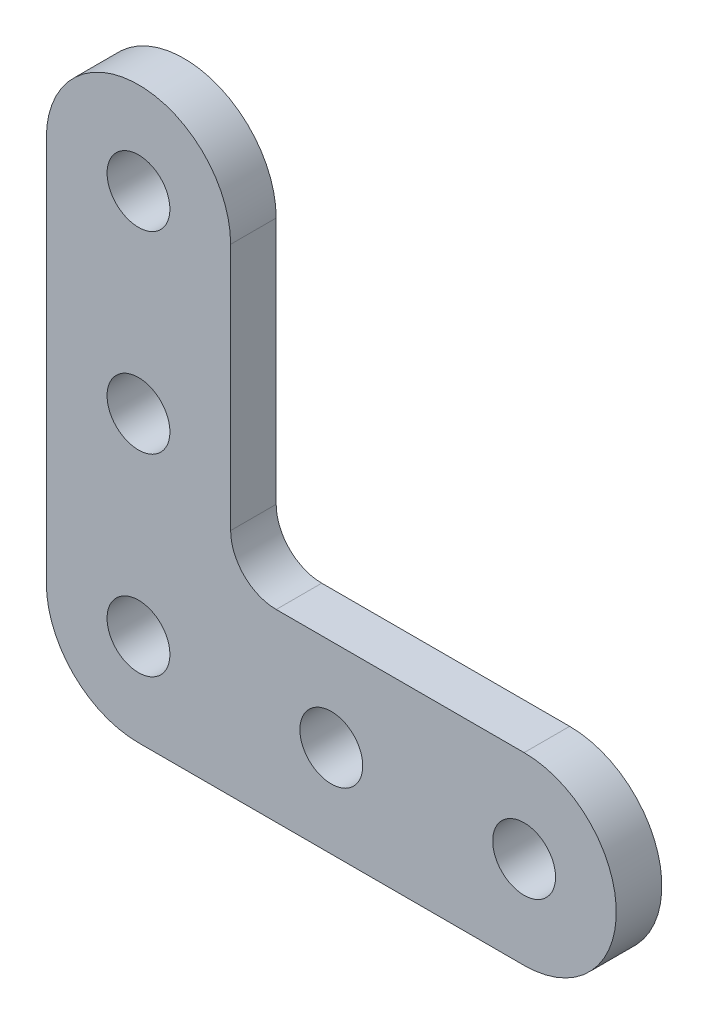
ISO-10303-21;
HEADER;
FILE_DESCRIPTION(('STEP AP214'),'2;1');
FILE_NAME('part.step','',(''),(''),'','','');
FILE_SCHEMA(('AUTOMOTIVE_DESIGN { 1 0 10303 214 1 1 1 1 }'));
ENDSEC;
DATA;
#1=APPLICATION_CONTEXT('core data for automotive mechanical design processes');
#2=APPLICATION_PROTOCOL_DEFINITION('international standard','automotive_design',2000,#1);
#3=PRODUCT_CONTEXT('',#1,'mechanical');
#4=PRODUCT('Part','Part','',(#3));
#5=PRODUCT_RELATED_PRODUCT_CATEGORY('part','',(#4));
#6=PRODUCT_DEFINITION_FORMATION('','',#4);
#7=PRODUCT_DEFINITION_CONTEXT('part definition',#1,'design');
#8=PRODUCT_DEFINITION('design','',#6,#7);
#9=PRODUCT_DEFINITION_SHAPE('','',#8);
#10=(LENGTH_UNIT() NAMED_UNIT(*) SI_UNIT(.MILLI.,.METRE.));
#11=(NAMED_UNIT(*) PLANE_ANGLE_UNIT() SI_UNIT($,.RADIAN.));
#12=(NAMED_UNIT(*) SI_UNIT($,.STERADIAN.) SOLID_ANGLE_UNIT());
#13=UNCERTAINTY_MEASURE_WITH_UNIT(LENGTH_MEASURE(1.E-05),#10,'distance_accuracy_value','');
#14=(GEOMETRIC_REPRESENTATION_CONTEXT(3) GLOBAL_UNCERTAINTY_ASSIGNED_CONTEXT((#13)) GLOBAL_UNIT_ASSIGNED_CONTEXT((#10,
#11,#12)) REPRESENTATION_CONTEXT('',''));
#15=CARTESIAN_POINT('',(0.,0.,0.));
#16=DIRECTION('',(0.,0.,1.));
#17=DIRECTION('',(1.,0.,0.));
#18=AXIS2_PLACEMENT_3D('',#15,#16,#17);
#19=CARTESIAN_POINT('',(-6.07,0.,1.5));
#20=DIRECTION('',(1.,0.,0.));
#21=DIRECTION('',(0.,0.,-1.));
#22=AXIS2_PLACEMENT_3D('',#19,#20,#21);
#23=PLANE('',#22);
#24=DIRECTION('',(0.,-1.,0.));
#25=VECTOR('',#24,1.);
#26=CARTESIAN_POINT('',(-6.07,0.,-1.5));
#27=LINE('',#26,#25);
#28=CARTESIAN_POINT('',(-6.07,25.4,-1.5));
#29=VERTEX_POINT('',#28);
#30=CARTESIAN_POINT('',(-6.07,0.,-1.5));
#31=VERTEX_POINT('',#30);
#32=EDGE_CURVE('E132',#29,#31,#27,.T.);
#33=ORIENTED_EDGE('',*,*,#32,.T.);
#34=DIRECTION('',(0.,0.,-1.));
#35=VECTOR('',#34,1.);
#36=CARTESIAN_POINT('',(-6.07,0.,1.5));
#37=LINE('',#36,#35);
#38=CARTESIAN_POINT('',(-6.07,0.,1.5));
#39=VERTEX_POINT('',#38);
#40=EDGE_CURVE('E109',#39,#31,#37,.T.);
#41=ORIENTED_EDGE('',*,*,#40,.F.);
#42=DIRECTION('',(0.,-1.,0.));
#43=VECTOR('',#42,1.);
#44=CARTESIAN_POINT('',(-6.07,0.,1.5));
#45=LINE('',#44,#43);
#46=CARTESIAN_POINT('',(-6.07,25.4,1.5));
#47=VERTEX_POINT('',#46);
#48=EDGE_CURVE('E117',#47,#39,#45,.T.);
#49=ORIENTED_EDGE('',*,*,#48,.F.);
#50=DIRECTION('',(0.,0.,-1.));
#51=VECTOR('',#50,1.);
#52=CARTESIAN_POINT('',(-6.07,25.4,1.5));
#53=LINE('',#52,#51);
#54=EDGE_CURVE('E156',#47,#29,#53,.T.);
#55=ORIENTED_EDGE('',*,*,#54,.T.);
#56=EDGE_LOOP('',(#33,#41,#49,#55));
#57=FACE_BOUND('',#56,.T.);
#58=ADVANCED_FACE('F39',(#57),#23,.F.);
#59=CARTESIAN_POINT('',(0.,0.,1.5));
#60=DIRECTION('',(0.,0.,-1.));
#61=DIRECTION('',(-1.,0.,0.));
#62=AXIS2_PLACEMENT_3D('',#59,#60,#61);
#63=CYLINDRICAL_SURFACE('',#62,6.07);
#64=CARTESIAN_POINT('',(0.,0.,-1.5));
#65=DIRECTION('',(0.,0.,1.));
#66=DIRECTION('',(1.,0.,0.));
#67=AXIS2_PLACEMENT_3D('',#64,#65,#66);
#68=CIRCLE('',#67,6.07);
#69=CARTESIAN_POINT('',(0.,-6.07,-1.5));
#70=VERTEX_POINT('',#69);
#71=EDGE_CURVE('E194',#31,#70,#68,.T.);
#72=ORIENTED_EDGE('',*,*,#71,.T.);
#73=DIRECTION('',(0.,0.,-1.));
#74=VECTOR('',#73,1.);
#75=CARTESIAN_POINT('',(0.,-6.07,1.5));
#76=LINE('',#75,#74);
#77=CARTESIAN_POINT('',(0.,-6.07,1.5));
#78=VERTEX_POINT('',#77);
#79=EDGE_CURVE('E112',#78,#70,#76,.T.);
#80=ORIENTED_EDGE('',*,*,#79,.F.);
#81=CARTESIAN_POINT('',(0.,0.,1.5));
#82=DIRECTION('',(0.,0.,1.));
#83=DIRECTION('',(1.,0.,0.));
#84=AXIS2_PLACEMENT_3D('',#81,#82,#83);
#85=CIRCLE('',#84,6.07);
#86=EDGE_CURVE('E105',#39,#78,#85,.T.);
#87=ORIENTED_EDGE('',*,*,#86,.F.);
#88=ORIENTED_EDGE('',*,*,#40,.T.);
#89=EDGE_LOOP('',(#72,#80,#87,#88));
#90=FACE_BOUND('',#89,.T.);
#91=ADVANCED_FACE('F107',(#90),#63,.T.);
#92=CARTESIAN_POINT('',(0.,-6.07,1.5));
#93=DIRECTION('',(0.,1.,0.));
#94=DIRECTION('',(-1.,0.,0.));
#95=AXIS2_PLACEMENT_3D('',#92,#93,#94);
#96=PLANE('',#95);
#97=DIRECTION('',(1.,0.,0.));
#98=VECTOR('',#97,1.);
#99=CARTESIAN_POINT('',(0.,-6.07,-1.5));
#100=LINE('',#99,#98);
#101=CARTESIAN_POINT('',(25.4,-6.07,-1.5));
#102=VERTEX_POINT('',#101);
#103=EDGE_CURVE('E191',#70,#102,#100,.T.);
#104=ORIENTED_EDGE('',*,*,#103,.T.);
#105=DIRECTION('',(0.,0.,-1.));
#106=VECTOR('',#105,1.);
#107=CARTESIAN_POINT('',(25.4,-6.07,1.5));
#108=LINE('',#107,#106);
#109=CARTESIAN_POINT('',(25.4,-6.07,1.5));
#110=VERTEX_POINT('',#109);
#111=EDGE_CURVE('E140',#110,#102,#108,.T.);
#112=ORIENTED_EDGE('',*,*,#111,.F.);
#113=DIRECTION('',(1.,0.,0.));
#114=VECTOR('',#113,1.);
#115=CARTESIAN_POINT('',(0.,-6.07,1.5));
#116=LINE('',#115,#114);
#117=EDGE_CURVE('E116',#78,#110,#116,.T.);
#118=ORIENTED_EDGE('',*,*,#117,.F.);
#119=ORIENTED_EDGE('',*,*,#79,.T.);
#120=EDGE_LOOP('',(#104,#112,#118,#119));
#121=FACE_BOUND('',#120,.T.);
#122=ADVANCED_FACE('F235',(#121),#96,.F.);
#123=CARTESIAN_POINT('',(25.4,0.,1.5));
#124=DIRECTION('',(0.,0.,-1.));
#125=DIRECTION('',(-1.,0.,0.));
#126=AXIS2_PLACEMENT_3D('',#123,#124,#125);
#127=CYLINDRICAL_SURFACE('',#126,6.07);
#128=CARTESIAN_POINT('',(25.4,0.,-1.5));
#129=DIRECTION('',(0.,0.,1.));
#130=DIRECTION('',(1.,0.,0.));
#131=AXIS2_PLACEMENT_3D('',#128,#129,#130);
#132=CIRCLE('',#131,6.07);
#133=CARTESIAN_POINT('',(25.4,6.07,-1.5));
#134=VERTEX_POINT('',#133);
#135=EDGE_CURVE('E188',#102,#134,#132,.T.);
#136=ORIENTED_EDGE('',*,*,#135,.T.);
#137=DIRECTION('',(0.,0.,-1.));
#138=VECTOR('',#137,1.);
#139=CARTESIAN_POINT('',(25.4,6.07,1.5));
#140=LINE('',#139,#138);
#141=CARTESIAN_POINT('',(25.4,6.07,1.5));
#142=VERTEX_POINT('',#141);
#143=EDGE_CURVE('E149',#142,#134,#140,.T.);
#144=ORIENTED_EDGE('',*,*,#143,.F.);
#145=CARTESIAN_POINT('',(25.4,0.,1.5));
#146=DIRECTION('',(0.,0.,1.));
#147=DIRECTION('',(1.,0.,0.));
#148=AXIS2_PLACEMENT_3D('',#145,#146,#147);
#149=CIRCLE('',#148,6.07);
#150=EDGE_CURVE('E227',#110,#142,#149,.T.);
#151=ORIENTED_EDGE('',*,*,#150,.F.);
#152=ORIENTED_EDGE('',*,*,#111,.T.);
#153=EDGE_LOOP('',(#136,#144,#151,#152));
#154=FACE_BOUND('',#153,.T.);
#155=ADVANCED_FACE('F239',(#154),#127,.T.);
#156=CARTESIAN_POINT('',(0.,6.07,1.5));
#157=DIRECTION('',(0.,-1.,0.));
#158=DIRECTION('',(1.,0.,0.));
#159=AXIS2_PLACEMENT_3D('',#156,#157,#158);
#160=PLANE('',#159);
#161=DIRECTION('',(-1.,0.,0.));
#162=VECTOR('',#161,1.);
#163=CARTESIAN_POINT('',(0.,6.07,-1.5));
#164=LINE('',#163,#162);
#165=CARTESIAN_POINT('',(9.07,6.07,-1.5));
#166=VERTEX_POINT('',#165);
#167=EDGE_CURVE('E185',#134,#166,#164,.T.);
#168=ORIENTED_EDGE('',*,*,#167,.T.);
#169=DIRECTION('',(0.,0.,-1.));
#170=VECTOR('',#169,1.);
#171=CARTESIAN_POINT('',(9.07,6.07,1.5));
#172=LINE('',#171,#170);
#173=CARTESIAN_POINT('',(9.07,6.07,1.5));
#174=VERTEX_POINT('',#173);
#175=EDGE_CURVE('E55',#166,#174,#172,.F.);
#176=ORIENTED_EDGE('',*,*,#175,.T.);
#177=DIRECTION('',(-1.,0.,0.));
#178=VECTOR('',#177,1.);
#179=CARTESIAN_POINT('',(0.,6.07,1.5));
#180=LINE('',#179,#178);
#181=EDGE_CURVE('E224',#142,#174,#180,.T.);
#182=ORIENTED_EDGE('',*,*,#181,.F.);
#183=ORIENTED_EDGE('',*,*,#143,.T.);
#184=EDGE_LOOP('',(#168,#176,#182,#183));
#185=FACE_BOUND('',#184,.T.);
#186=ADVANCED_FACE('F240',(#185),#160,.F.);
#187=CARTESIAN_POINT('',(6.07,0.,1.5));
#188=DIRECTION('',(1.,0.,0.));
#189=DIRECTION('',(0.,0.,-1.));
#190=AXIS2_PLACEMENT_3D('',#187,#188,#189);
#191=PLANE('',#190);
#192=DIRECTION('',(0.,-1.,0.));
#193=VECTOR('',#192,1.);
#194=CARTESIAN_POINT('',(6.07,0.,1.5));
#195=LINE('',#194,#193);
#196=CARTESIAN_POINT('',(6.07,25.4,1.5));
#197=VERTEX_POINT('',#196);
#198=CARTESIAN_POINT('',(6.07,9.07,1.5));
#199=VERTEX_POINT('',#198);
#200=EDGE_CURVE('E220',#197,#199,#195,.T.);
#201=ORIENTED_EDGE('',*,*,#200,.T.);
#202=DIRECTION('',(0.,0.,-1.));
#203=VECTOR('',#202,1.);
#204=CARTESIAN_POINT('',(6.07,9.07,1.5));
#205=LINE('',#204,#203);
#206=CARTESIAN_POINT('',(6.07,9.07,-1.5));
#207=VERTEX_POINT('',#206);
#208=EDGE_CURVE('E134',#199,#207,#205,.T.);
#209=ORIENTED_EDGE('',*,*,#208,.T.);
#210=DIRECTION('',(0.,-1.,0.));
#211=VECTOR('',#210,1.);
#212=CARTESIAN_POINT('',(6.07,0.,-1.5));
#213=LINE('',#212,#211);
#214=CARTESIAN_POINT('',(6.07,25.4,-1.5));
#215=VERTEX_POINT('',#214);
#216=EDGE_CURVE('E182',#215,#207,#213,.T.);
#217=ORIENTED_EDGE('',*,*,#216,.F.);
#218=DIRECTION('',(0.,0.,-1.));
#219=VECTOR('',#218,1.);
#220=CARTESIAN_POINT('',(6.07,25.4,1.5));
#221=LINE('',#220,#219);
#222=EDGE_CURVE('E153',#197,#215,#221,.T.);
#223=ORIENTED_EDGE('',*,*,#222,.F.);
#224=EDGE_LOOP('',(#201,#209,#217,#223));
#225=FACE_BOUND('',#224,.T.);
#226=ADVANCED_FACE('F246',(#225),#191,.T.);
#227=CARTESIAN_POINT('',(0.,0.,1.5));
#228=DIRECTION('',(0.,0.,-1.));
#229=DIRECTION('',(-1.,0.,0.));
#230=AXIS2_PLACEMENT_3D('',#227,#228,#229);
#231=CYLINDRICAL_SURFACE('',#230,2.07);
#232=CARTESIAN_POINT('',(0.,0.,1.5));
#233=DIRECTION('',(0.,0.,1.));
#234=DIRECTION('',(1.,0.,0.));
#235=AXIS2_PLACEMENT_3D('',#232,#233,#234);
#236=CIRCLE('',#235,2.07);
#237=CARTESIAN_POINT('',(2.07,0.,1.5));
#238=VERTEX_POINT('',#237);
#239=EDGE_CURVE('E202',#238,#238,#236,.T.);
#240=ORIENTED_EDGE('',*,*,#239,.T.);
#241=EDGE_LOOP('',(#240));
#242=FACE_BOUND('',#241,.T.);
#243=CARTESIAN_POINT('',(0.,0.,-1.5));
#244=DIRECTION('',(0.,0.,1.));
#245=DIRECTION('',(1.,0.,0.));
#246=AXIS2_PLACEMENT_3D('',#243,#244,#245);
#247=CIRCLE('',#246,2.07);
#248=CARTESIAN_POINT('',(2.07,0.,-1.5));
#249=VERTEX_POINT('',#248);
#250=EDGE_CURVE('E163',#249,#249,#247,.T.);
#251=ORIENTED_EDGE('',*,*,#250,.F.);
#252=EDGE_LOOP('',(#251));
#253=FACE_BOUND('',#252,.T.);
#254=ADVANCED_FACE('F278',(#242,#253),#231,.F.);
#255=CARTESIAN_POINT('',(12.7,0.,1.5));
#256=DIRECTION('',(0.,0.,-1.));
#257=DIRECTION('',(-1.,0.,0.));
#258=AXIS2_PLACEMENT_3D('',#255,#256,#257);
#259=CYLINDRICAL_SURFACE('',#258,2.07);
#260=CARTESIAN_POINT('',(12.7,0.,1.5));
#261=DIRECTION('',(0.,0.,1.));
#262=DIRECTION('',(1.,0.,0.));
#263=AXIS2_PLACEMENT_3D('',#260,#261,#262);
#264=CIRCLE('',#263,2.07);
#265=CARTESIAN_POINT('',(14.77,0.,1.5));
#266=VERTEX_POINT('',#265);
#267=EDGE_CURVE('E206',#266,#266,#264,.T.);
#268=ORIENTED_EDGE('',*,*,#267,.T.);
#269=EDGE_LOOP('',(#268));
#270=FACE_BOUND('',#269,.T.);
#271=CARTESIAN_POINT('',(12.7,0.,-1.5));
#272=DIRECTION('',(0.,0.,1.));
#273=DIRECTION('',(1.,0.,0.));
#274=AXIS2_PLACEMENT_3D('',#271,#272,#273);
#275=CIRCLE('',#274,2.07);
#276=CARTESIAN_POINT('',(14.77,0.,-1.5));
#277=VERTEX_POINT('',#276);
#278=EDGE_CURVE('E167',#277,#277,#275,.T.);
#279=ORIENTED_EDGE('',*,*,#278,.F.);
#280=EDGE_LOOP('',(#279));
#281=FACE_BOUND('',#280,.T.);
#282=ADVANCED_FACE('F282',(#270,#281),#259,.F.);
#283=CARTESIAN_POINT('',(0.,25.4,1.5));
#284=DIRECTION('',(0.,0.,-1.));
#285=DIRECTION('',(-1.,0.,0.));
#286=AXIS2_PLACEMENT_3D('',#283,#284,#285);
#287=CYLINDRICAL_SURFACE('',#286,2.07);
#288=CARTESIAN_POINT('',(0.,25.4,1.5));
#289=DIRECTION('',(0.,0.,1.));
#290=DIRECTION('',(1.,0.,0.));
#291=AXIS2_PLACEMENT_3D('',#288,#289,#290);
#292=CIRCLE('',#291,2.07);
#293=CARTESIAN_POINT('',(2.07,25.4,1.5));
#294=VERTEX_POINT('',#293);
#295=EDGE_CURVE('E210',#294,#294,#292,.T.);
#296=ORIENTED_EDGE('',*,*,#295,.T.);
#297=EDGE_LOOP('',(#296));
#298=FACE_BOUND('',#297,.T.);
#299=CARTESIAN_POINT('',(0.,25.4,-1.5));
#300=DIRECTION('',(0.,0.,1.));
#301=DIRECTION('',(1.,0.,0.));
#302=AXIS2_PLACEMENT_3D('',#299,#300,#301);
#303=CIRCLE('',#302,2.07);
#304=CARTESIAN_POINT('',(2.07,25.4,-1.5));
#305=VERTEX_POINT('',#304);
#306=EDGE_CURVE('E171',#305,#305,#303,.T.);
#307=ORIENTED_EDGE('',*,*,#306,.F.);
#308=EDGE_LOOP('',(#307));
#309=FACE_BOUND('',#308,.T.);
#310=ADVANCED_FACE('F262',(#298,#309),#287,.F.);
#311=CARTESIAN_POINT('',(0.,12.7,1.5));
#312=DIRECTION('',(0.,0.,-1.));
#313=DIRECTION('',(-1.,0.,0.));
#314=AXIS2_PLACEMENT_3D('',#311,#312,#313);
#315=CYLINDRICAL_SURFACE('',#314,2.07);
#316=CARTESIAN_POINT('',(0.,12.7,1.5));
#317=DIRECTION('',(0.,0.,1.));
#318=DIRECTION('',(1.,0.,0.));
#319=AXIS2_PLACEMENT_3D('',#316,#317,#318);
#320=CIRCLE('',#319,2.07);
#321=CARTESIAN_POINT('',(2.07,12.7,1.5));
#322=VERTEX_POINT('',#321);
#323=EDGE_CURVE('E214',#322,#322,#320,.T.);
#324=ORIENTED_EDGE('',*,*,#323,.T.);
#325=EDGE_LOOP('',(#324));
#326=FACE_BOUND('',#325,.T.);
#327=CARTESIAN_POINT('',(0.,12.7,-1.5));
#328=DIRECTION('',(0.,0.,1.));
#329=DIRECTION('',(1.,0.,0.));
#330=AXIS2_PLACEMENT_3D('',#327,#328,#329);
#331=CIRCLE('',#330,2.07);
#332=CARTESIAN_POINT('',(2.07,12.7,-1.5));
#333=VERTEX_POINT('',#332);
#334=EDGE_CURVE('E175',#333,#333,#331,.T.);
#335=ORIENTED_EDGE('',*,*,#334,.F.);
#336=EDGE_LOOP('',(#335));
#337=FACE_BOUND('',#336,.T.);
#338=ADVANCED_FACE('F254',(#326,#337),#315,.F.);
#339=CARTESIAN_POINT('',(0.,25.4,1.5));
#340=DIRECTION('',(0.,0.,-1.));
#341=DIRECTION('',(-1.,0.,0.));
#342=AXIS2_PLACEMENT_3D('',#339,#340,#341);
#343=CYLINDRICAL_SURFACE('',#342,6.07);
#344=CARTESIAN_POINT('',(0.,25.4,-1.5));
#345=DIRECTION('',(0.,0.,1.));
#346=DIRECTION('',(1.,0.,0.));
#347=AXIS2_PLACEMENT_3D('',#344,#345,#346);
#348=CIRCLE('',#347,6.07);
#349=EDGE_CURVE('E179',#215,#29,#348,.T.);
#350=ORIENTED_EDGE('',*,*,#349,.T.);
#351=ORIENTED_EDGE('',*,*,#54,.F.);
#352=CARTESIAN_POINT('',(0.,25.4,1.5));
#353=DIRECTION('',(0.,0.,1.));
#354=DIRECTION('',(1.,0.,0.));
#355=AXIS2_PLACEMENT_3D('',#352,#353,#354);
#356=CIRCLE('',#355,6.07);
#357=EDGE_CURVE('E124',#197,#47,#356,.T.);
#358=ORIENTED_EDGE('',*,*,#357,.F.);
#359=ORIENTED_EDGE('',*,*,#222,.T.);
#360=EDGE_LOOP('',(#350,#351,#358,#359));
#361=FACE_BOUND('',#360,.T.);
#362=ADVANCED_FACE('F251',(#361),#343,.T.);
#363=CARTESIAN_POINT('',(25.4,0.,1.5));
#364=DIRECTION('',(0.,0.,-1.));
#365=DIRECTION('',(-1.,0.,0.));
#366=AXIS2_PLACEMENT_3D('',#363,#364,#365);
#367=CYLINDRICAL_SURFACE('',#366,2.07);
#368=CARTESIAN_POINT('',(25.4,0.,1.5));
#369=DIRECTION('',(0.,0.,1.));
#370=DIRECTION('',(1.,0.,0.));
#371=AXIS2_PLACEMENT_3D('',#368,#369,#370);
#372=CIRCLE('',#371,2.07);
#373=CARTESIAN_POINT('',(27.47,0.,1.5));
#374=VERTEX_POINT('',#373);
#375=EDGE_CURVE('E159',#374,#374,#372,.T.);
#376=ORIENTED_EDGE('',*,*,#375,.T.);
#377=EDGE_LOOP('',(#376));
#378=FACE_BOUND('',#377,.T.);
#379=CARTESIAN_POINT('',(25.4,0.,-1.5));
#380=DIRECTION('',(0.,0.,1.));
#381=DIRECTION('',(1.,0.,0.));
#382=AXIS2_PLACEMENT_3D('',#379,#380,#381);
#383=CIRCLE('',#382,2.07);
#384=CARTESIAN_POINT('',(27.47,0.,-1.5));
#385=VERTEX_POINT('',#384);
#386=EDGE_CURVE('E129',#385,#385,#383,.T.);
#387=ORIENTED_EDGE('',*,*,#386,.F.);
#388=EDGE_LOOP('',(#387));
#389=FACE_BOUND('',#388,.T.);
#390=ADVANCED_FACE('F253',(#378,#389),#367,.F.);
#391=CARTESIAN_POINT('',(0.,0.,1.5));
#392=DIRECTION('',(0.,0.,1.));
#393=DIRECTION('',(1.,0.,0.));
#394=AXIS2_PLACEMENT_3D('',#391,#392,#393);
#395=PLANE('',#394);
#396=ORIENTED_EDGE('',*,*,#48,.T.);
#397=ORIENTED_EDGE('',*,*,#86,.T.);
#398=ORIENTED_EDGE('',*,*,#117,.T.);
#399=ORIENTED_EDGE('',*,*,#150,.T.);
#400=ORIENTED_EDGE('',*,*,#181,.T.);
#401=CARTESIAN_POINT('',(9.07,9.07,1.5));
#402=DIRECTION('',(0.,0.,1.));
#403=DIRECTION('',(1.,0.,0.));
#404=AXIS2_PLACEMENT_3D('',#401,#402,#403);
#405=CIRCLE('',#404,3.);
#406=EDGE_CURVE('E11',#174,#199,#405,.F.);
#407=ORIENTED_EDGE('',*,*,#406,.T.);
#408=ORIENTED_EDGE('',*,*,#200,.F.);
#409=ORIENTED_EDGE('',*,*,#357,.T.);
#410=EDGE_LOOP('',(#396,#397,#398,#399,#400,#407,#408,#409));
#411=FACE_BOUND('',#410,.T.);
#412=ORIENTED_EDGE('',*,*,#323,.F.);
#413=EDGE_LOOP('',(#412));
#414=FACE_BOUND('',#413,.T.);
#415=ORIENTED_EDGE('',*,*,#295,.F.);
#416=EDGE_LOOP('',(#415));
#417=FACE_BOUND('',#416,.T.);
#418=ORIENTED_EDGE('',*,*,#267,.F.);
#419=EDGE_LOOP('',(#418));
#420=FACE_BOUND('',#419,.T.);
#421=ORIENTED_EDGE('',*,*,#239,.F.);
#422=EDGE_LOOP('',(#421));
#423=FACE_BOUND('',#422,.T.);
#424=ORIENTED_EDGE('',*,*,#375,.F.);
#425=EDGE_LOOP('',(#424));
#426=FACE_BOUND('',#425,.T.);
#427=ADVANCED_FACE('F120',(#411,#414,#417,#420,#423,#426),#395,.T.);
#428=CARTESIAN_POINT('',(0.,0.,-1.5));
#429=DIRECTION('',(0.,0.,1.));
#430=DIRECTION('',(1.,0.,0.));
#431=AXIS2_PLACEMENT_3D('',#428,#429,#430);
#432=PLANE('',#431);
#433=ORIENTED_EDGE('',*,*,#32,.F.);
#434=ORIENTED_EDGE('',*,*,#349,.F.);
#435=ORIENTED_EDGE('',*,*,#216,.T.);
#436=CARTESIAN_POINT('',(9.07,9.07,-1.5));
#437=DIRECTION('',(0.,0.,1.));
#438=DIRECTION('',(1.,0.,0.));
#439=AXIS2_PLACEMENT_3D('',#436,#437,#438);
#440=CIRCLE('',#439,3.);
#441=EDGE_CURVE('E48',#207,#166,#440,.T.);
#442=ORIENTED_EDGE('',*,*,#441,.T.);
#443=ORIENTED_EDGE('',*,*,#167,.F.);
#444=ORIENTED_EDGE('',*,*,#135,.F.);
#445=ORIENTED_EDGE('',*,*,#103,.F.);
#446=ORIENTED_EDGE('',*,*,#71,.F.);
#447=EDGE_LOOP('',(#433,#434,#435,#442,#443,#444,#445,#446));
#448=FACE_BOUND('',#447,.T.);
#449=ORIENTED_EDGE('',*,*,#334,.T.);
#450=EDGE_LOOP('',(#449));
#451=FACE_BOUND('',#450,.T.);
#452=ORIENTED_EDGE('',*,*,#306,.T.);
#453=EDGE_LOOP('',(#452));
#454=FACE_BOUND('',#453,.T.);
#455=ORIENTED_EDGE('',*,*,#278,.T.);
#456=EDGE_LOOP('',(#455));
#457=FACE_BOUND('',#456,.T.);
#458=ORIENTED_EDGE('',*,*,#250,.T.);
#459=EDGE_LOOP('',(#458));
#460=FACE_BOUND('',#459,.T.);
#461=ORIENTED_EDGE('',*,*,#386,.T.);
#462=EDGE_LOOP('',(#461));
#463=FACE_BOUND('',#462,.T.);
#464=ADVANCED_FACE('F248',(#448,#451,#454,#457,#460,#463),#432,.F.);
#465=CARTESIAN_POINT('',(9.07,9.07,1.5));
#466=DIRECTION('',(0.,0.,-1.));
#467=DIRECTION('',(-1.,0.,0.));
#468=AXIS2_PLACEMENT_3D('',#465,#466,#467);
#469=CYLINDRICAL_SURFACE('',#468,3.);
#470=ORIENTED_EDGE('',*,*,#406,.F.);
#471=ORIENTED_EDGE('',*,*,#175,.F.);
#472=ORIENTED_EDGE('',*,*,#441,.F.);
#473=ORIENTED_EDGE('',*,*,#208,.F.);
#474=EDGE_LOOP('',(#470,#471,#472,#473));
#475=FACE_BOUND('',#474,.T.);
#476=ADVANCED_FACE('F41',(#475),#469,.F.);
#477=CLOSED_SHELL('',(#58,#91,#122,#155,#186,#226,#254,#282,#310,#338,#362,#390,#427,#464,#476));
#478=MANIFOLD_SOLID_BREP('B2',#477);
#479=ADVANCED_BREP_SHAPE_REPRESENTATION('',(#18,#478),#14);
#480=SHAPE_DEFINITION_REPRESENTATION(#9,#479);
ENDSEC;
END-ISO-10303-21;
